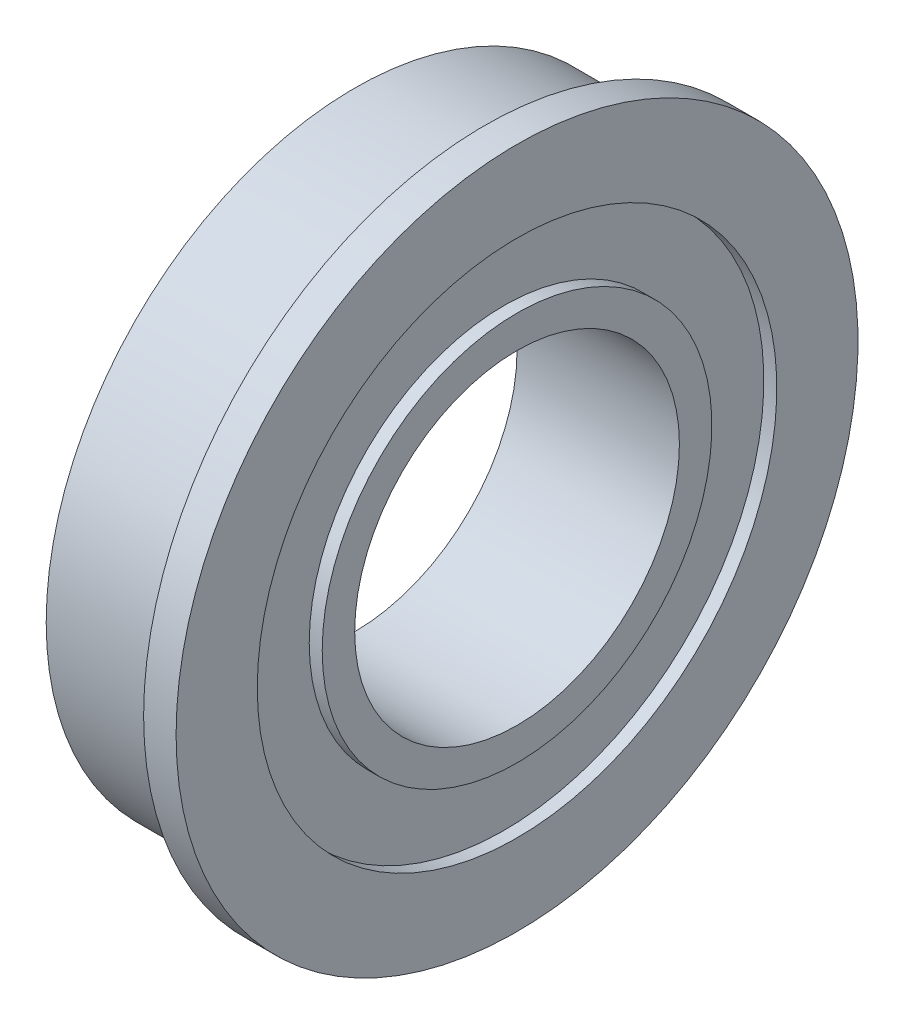
ISO-10303-21;
HEADER;
FILE_DESCRIPTION(('STEP AP214'),'2;1');
FILE_NAME('part.step','',(''),(''),'','','');
FILE_SCHEMA(('AUTOMOTIVE_DESIGN { 1 0 10303 214 1 1 1 1 }'));
ENDSEC;
DATA;
#1=APPLICATION_CONTEXT('core data for automotive mechanical design processes');
#2=APPLICATION_PROTOCOL_DEFINITION('international standard','automotive_design',2000,#1);
#3=PRODUCT_CONTEXT('',#1,'mechanical');
#4=PRODUCT('Part','Part','',(#3));
#5=PRODUCT_RELATED_PRODUCT_CATEGORY('part','',(#4));
#6=PRODUCT_DEFINITION_FORMATION('','',#4);
#7=PRODUCT_DEFINITION_CONTEXT('part definition',#1,'design');
#8=PRODUCT_DEFINITION('design','',#6,#7);
#9=PRODUCT_DEFINITION_SHAPE('','',#8);
#10=(LENGTH_UNIT() NAMED_UNIT(*) SI_UNIT(.MILLI.,.METRE.));
#11=(NAMED_UNIT(*) PLANE_ANGLE_UNIT() SI_UNIT($,.RADIAN.));
#12=(NAMED_UNIT(*) SI_UNIT($,.STERADIAN.) SOLID_ANGLE_UNIT());
#13=UNCERTAINTY_MEASURE_WITH_UNIT(LENGTH_MEASURE(1.E-05),#10,'distance_accuracy_value','');
#14=(GEOMETRIC_REPRESENTATION_CONTEXT(3) GLOBAL_UNCERTAINTY_ASSIGNED_CONTEXT((#13)) GLOBAL_UNIT_ASSIGNED_CONTEXT((#10,
#11,#12)) REPRESENTATION_CONTEXT('',''));
#15=CARTESIAN_POINT('',(0.,0.,0.));
#16=DIRECTION('',(0.,0.,1.));
#17=DIRECTION('',(1.,0.,0.));
#18=AXIS2_PLACEMENT_3D('',#15,#16,#17);
#19=CARTESIAN_POINT('',(4.,9.5,0.));
#20=DIRECTION('',(1.,0.,0.));
#21=DIRECTION('',(0.,0.,-1.));
#22=AXIS2_PLACEMENT_3D('',#19,#20,#21);
#23=PLANE('',#22);
#24=CARTESIAN_POINT('',(4.,0.,0.));
#25=DIRECTION('',(-1.,0.,0.));
#26=DIRECTION('',(0.,0.,1.));
#27=AXIS2_PLACEMENT_3D('',#24,#25,#26);
#28=CIRCLE('',#27,9.5);
#29=CARTESIAN_POINT('',(4.,0.,9.5));
#30=VERTEX_POINT('',#29);
#31=EDGE_CURVE('E10',#30,#30,#28,.T.);
#32=ORIENTED_EDGE('',*,*,#31,.F.);
#33=EDGE_LOOP('',(#32));
#34=FACE_BOUND('',#33,.T.);
#35=CARTESIAN_POINT('',(4.,0.,0.));
#36=DIRECTION('',(-1.,0.,0.));
#37=DIRECTION('',(0.,0.,1.));
#38=AXIS2_PLACEMENT_3D('',#35,#36,#37);
#39=CIRCLE('',#38,10.5);
#40=CARTESIAN_POINT('',(4.,0.,10.5));
#41=VERTEX_POINT('',#40);
#42=EDGE_CURVE('E21',#41,#41,#39,.T.);
#43=ORIENTED_EDGE('',*,*,#42,.T.);
#44=EDGE_LOOP('',(#43));
#45=FACE_BOUND('',#44,.T.);
#46=ADVANCED_FACE('F15',(#34,#45),#23,.F.);
#47=CARTESIAN_POINT('',(0.,0.,0.));
#48=DIRECTION('',(-1.,0.,0.));
#49=DIRECTION('',(0.,0.,1.));
#50=AXIS2_PLACEMENT_3D('',#47,#48,#49);
#51=CYLINDRICAL_SURFACE('',#50,10.5);
#52=ORIENTED_EDGE('',*,*,#42,.F.);
#53=EDGE_LOOP('',(#52));
#54=FACE_BOUND('',#53,.T.);
#55=CARTESIAN_POINT('',(5.,0.,0.));
#56=DIRECTION('',(-1.,0.,0.));
#57=DIRECTION('',(0.,0.,1.));
#58=AXIS2_PLACEMENT_3D('',#55,#56,#57);
#59=CIRCLE('',#58,10.5);
#60=CARTESIAN_POINT('',(5.,0.,10.5));
#61=VERTEX_POINT('',#60);
#62=EDGE_CURVE('E25',#61,#61,#59,.T.);
#63=ORIENTED_EDGE('',*,*,#62,.T.);
#64=EDGE_LOOP('',(#63));
#65=FACE_BOUND('',#64,.T.);
#66=ADVANCED_FACE('F78',(#54,#65),#51,.T.);
#67=CARTESIAN_POINT('',(5.,10.5,0.));
#68=DIRECTION('',(-1.,0.,0.));
#69=DIRECTION('',(0.,0.,1.));
#70=AXIS2_PLACEMENT_3D('',#67,#68,#69);
#71=PLANE('',#70);
#72=ORIENTED_EDGE('',*,*,#62,.F.);
#73=EDGE_LOOP('',(#72));
#74=FACE_BOUND('',#73,.T.);
#75=CARTESIAN_POINT('',(5.,0.,0.));
#76=DIRECTION('',(-1.,0.,0.));
#77=DIRECTION('',(0.,0.,1.));
#78=AXIS2_PLACEMENT_3D('',#75,#76,#77);
#79=CIRCLE('',#78,8.);
#80=CARTESIAN_POINT('',(5.,0.,8.));
#81=VERTEX_POINT('',#80);
#82=EDGE_CURVE('E29',#81,#81,#79,.T.);
#83=ORIENTED_EDGE('',*,*,#82,.T.);
#84=EDGE_LOOP('',(#83));
#85=FACE_BOUND('',#84,.T.);
#86=ADVANCED_FACE('F83',(#74,#85),#71,.F.);
#87=CARTESIAN_POINT('',(0.,0.,0.));
#88=DIRECTION('',(-1.,0.,0.));
#89=DIRECTION('',(0.,0.,1.));
#90=AXIS2_PLACEMENT_3D('',#87,#88,#89);
#91=CYLINDRICAL_SURFACE('',#90,8.);
#92=ORIENTED_EDGE('',*,*,#82,.F.);
#93=EDGE_LOOP('',(#92));
#94=FACE_BOUND('',#93,.T.);
#95=CARTESIAN_POINT('',(4.6,0.,0.));
#96=DIRECTION('',(-1.,0.,0.));
#97=DIRECTION('',(0.,0.,1.));
#98=AXIS2_PLACEMENT_3D('',#95,#96,#97);
#99=CIRCLE('',#98,8.);
#100=CARTESIAN_POINT('',(4.6,0.,8.));
#101=VERTEX_POINT('',#100);
#102=EDGE_CURVE('E34',#101,#101,#99,.T.);
#103=ORIENTED_EDGE('',*,*,#102,.T.);
#104=EDGE_LOOP('',(#103));
#105=FACE_BOUND('',#104,.T.);
#106=ADVANCED_FACE('F88',(#94,#105),#91,.F.);
#107=CARTESIAN_POINT('',(4.6,8.,0.));
#108=DIRECTION('',(-1.,0.,0.));
#109=DIRECTION('',(0.,0.,1.));
#110=AXIS2_PLACEMENT_3D('',#107,#108,#109);
#111=PLANE('',#110);
#112=ORIENTED_EDGE('',*,*,#102,.F.);
#113=EDGE_LOOP('',(#112));
#114=FACE_BOUND('',#113,.T.);
#115=CARTESIAN_POINT('',(4.6,0.,0.));
#116=DIRECTION('',(-1.,0.,0.));
#117=DIRECTION('',(0.,0.,1.));
#118=AXIS2_PLACEMENT_3D('',#115,#116,#117);
#119=CIRCLE('',#118,6.);
#120=CARTESIAN_POINT('',(4.6,0.,6.));
#121=VERTEX_POINT('',#120);
#122=EDGE_CURVE('E37',#121,#121,#119,.T.);
#123=ORIENTED_EDGE('',*,*,#122,.T.);
#124=EDGE_LOOP('',(#123));
#125=FACE_BOUND('',#124,.T.);
#126=ADVANCED_FACE('F95',(#114,#125),#111,.F.);
#127=CARTESIAN_POINT('',(0.,0.,0.));
#128=DIRECTION('',(-1.,0.,0.));
#129=DIRECTION('',(0.,0.,1.));
#130=AXIS2_PLACEMENT_3D('',#127,#128,#129);
#131=CYLINDRICAL_SURFACE('',#130,6.);
#132=ORIENTED_EDGE('',*,*,#122,.F.);
#133=EDGE_LOOP('',(#132));
#134=FACE_BOUND('',#133,.T.);
#135=CARTESIAN_POINT('',(5.,0.,0.));
#136=DIRECTION('',(-1.,0.,0.));
#137=DIRECTION('',(0.,0.,1.));
#138=AXIS2_PLACEMENT_3D('',#135,#136,#137);
#139=CIRCLE('',#138,6.);
#140=CARTESIAN_POINT('',(5.,0.,6.));
#141=VERTEX_POINT('',#140);
#142=EDGE_CURVE('E40',#141,#141,#139,.T.);
#143=ORIENTED_EDGE('',*,*,#142,.T.);
#144=EDGE_LOOP('',(#143));
#145=FACE_BOUND('',#144,.T.);
#146=ADVANCED_FACE('F99',(#134,#145),#131,.T.);
#147=CARTESIAN_POINT('',(5.,6.,0.));
#148=DIRECTION('',(-1.,0.,0.));
#149=DIRECTION('',(0.,0.,1.));
#150=AXIS2_PLACEMENT_3D('',#147,#148,#149);
#151=PLANE('',#150);
#152=ORIENTED_EDGE('',*,*,#142,.F.);
#153=EDGE_LOOP('',(#152));
#154=FACE_BOUND('',#153,.T.);
#155=CARTESIAN_POINT('',(5.,0.,0.));
#156=DIRECTION('',(-1.,0.,0.));
#157=DIRECTION('',(0.,0.,1.));
#158=AXIS2_PLACEMENT_3D('',#155,#156,#157);
#159=CIRCLE('',#158,5.);
#160=CARTESIAN_POINT('',(5.,0.,5.));
#161=VERTEX_POINT('',#160);
#162=EDGE_CURVE('E43',#161,#161,#159,.T.);
#163=ORIENTED_EDGE('',*,*,#162,.T.);
#164=EDGE_LOOP('',(#163));
#165=FACE_BOUND('',#164,.T.);
#166=ADVANCED_FACE('F103',(#154,#165),#151,.F.);
#167=CARTESIAN_POINT('',(0.,0.,0.));
#168=DIRECTION('',(-1.,0.,0.));
#169=DIRECTION('',(0.,0.,1.));
#170=AXIS2_PLACEMENT_3D('',#167,#168,#169);
#171=CYLINDRICAL_SURFACE('',#170,5.);
#172=ORIENTED_EDGE('',*,*,#162,.F.);
#173=EDGE_LOOP('',(#172));
#174=FACE_BOUND('',#173,.T.);
#175=CARTESIAN_POINT('',(0.,0.,0.));
#176=DIRECTION('',(-1.,0.,0.));
#177=DIRECTION('',(0.,0.,1.));
#178=AXIS2_PLACEMENT_3D('',#175,#176,#177);
#179=CIRCLE('',#178,5.);
#180=CARTESIAN_POINT('',(0.,0.,5.));
#181=VERTEX_POINT('',#180);
#182=EDGE_CURVE('E46',#181,#181,#179,.T.);
#183=ORIENTED_EDGE('',*,*,#182,.T.);
#184=EDGE_LOOP('',(#183));
#185=FACE_BOUND('',#184,.T.);
#186=ADVANCED_FACE('F107',(#174,#185),#171,.F.);
#187=CARTESIAN_POINT('',(0.,5.,0.));
#188=DIRECTION('',(1.,0.,0.));
#189=DIRECTION('',(0.,0.,-1.));
#190=AXIS2_PLACEMENT_3D('',#187,#188,#189);
#191=PLANE('',#190);
#192=ORIENTED_EDGE('',*,*,#182,.F.);
#193=EDGE_LOOP('',(#192));
#194=FACE_BOUND('',#193,.T.);
#195=CARTESIAN_POINT('',(0.,0.,0.));
#196=DIRECTION('',(-1.,0.,0.));
#197=DIRECTION('',(0.,0.,1.));
#198=AXIS2_PLACEMENT_3D('',#195,#196,#197);
#199=CIRCLE('',#198,6.);
#200=CARTESIAN_POINT('',(0.,0.,6.));
#201=VERTEX_POINT('',#200);
#202=EDGE_CURVE('E49',#201,#201,#199,.T.);
#203=ORIENTED_EDGE('',*,*,#202,.T.);
#204=EDGE_LOOP('',(#203));
#205=FACE_BOUND('',#204,.T.);
#206=ADVANCED_FACE('F111',(#194,#205),#191,.F.);
#207=CARTESIAN_POINT('',(0.,0.,0.));
#208=DIRECTION('',(-1.,0.,0.));
#209=DIRECTION('',(0.,0.,1.));
#210=AXIS2_PLACEMENT_3D('',#207,#208,#209);
#211=CYLINDRICAL_SURFACE('',#210,6.);
#212=ORIENTED_EDGE('',*,*,#202,.F.);
#213=EDGE_LOOP('',(#212));
#214=FACE_BOUND('',#213,.T.);
#215=CARTESIAN_POINT('',(0.4,0.,0.));
#216=DIRECTION('',(-1.,0.,0.));
#217=DIRECTION('',(0.,0.,1.));
#218=AXIS2_PLACEMENT_3D('',#215,#216,#217);
#219=CIRCLE('',#218,6.);
#220=CARTESIAN_POINT('',(0.4,0.,6.));
#221=VERTEX_POINT('',#220);
#222=EDGE_CURVE('E52',#221,#221,#219,.T.);
#223=ORIENTED_EDGE('',*,*,#222,.T.);
#224=EDGE_LOOP('',(#223));
#225=FACE_BOUND('',#224,.T.);
#226=ADVANCED_FACE('F115',(#214,#225),#211,.T.);
#227=CARTESIAN_POINT('',(0.4,6.,0.));
#228=DIRECTION('',(1.,0.,0.));
#229=DIRECTION('',(0.,0.,-1.));
#230=AXIS2_PLACEMENT_3D('',#227,#228,#229);
#231=PLANE('',#230);
#232=ORIENTED_EDGE('',*,*,#222,.F.);
#233=EDGE_LOOP('',(#232));
#234=FACE_BOUND('',#233,.T.);
#235=CARTESIAN_POINT('',(0.4,0.,0.));
#236=DIRECTION('',(-1.,0.,0.));
#237=DIRECTION('',(0.,0.,1.));
#238=AXIS2_PLACEMENT_3D('',#235,#236,#237);
#239=CIRCLE('',#238,8.);
#240=CARTESIAN_POINT('',(0.4,0.,8.));
#241=VERTEX_POINT('',#240);
#242=EDGE_CURVE('E55',#241,#241,#239,.T.);
#243=ORIENTED_EDGE('',*,*,#242,.T.);
#244=EDGE_LOOP('',(#243));
#245=FACE_BOUND('',#244,.T.);
#246=ADVANCED_FACE('F119',(#234,#245),#231,.F.);
#247=CARTESIAN_POINT('',(0.,0.,0.));
#248=DIRECTION('',(-1.,0.,0.));
#249=DIRECTION('',(0.,0.,1.));
#250=AXIS2_PLACEMENT_3D('',#247,#248,#249);
#251=CYLINDRICAL_SURFACE('',#250,8.);
#252=ORIENTED_EDGE('',*,*,#242,.F.);
#253=EDGE_LOOP('',(#252));
#254=FACE_BOUND('',#253,.T.);
#255=CARTESIAN_POINT('',(0.,0.,0.));
#256=DIRECTION('',(-1.,0.,0.));
#257=DIRECTION('',(0.,0.,1.));
#258=AXIS2_PLACEMENT_3D('',#255,#256,#257);
#259=CIRCLE('',#258,8.);
#260=CARTESIAN_POINT('',(0.,0.,8.));
#261=VERTEX_POINT('',#260);
#262=EDGE_CURVE('E58',#261,#261,#259,.T.);
#263=ORIENTED_EDGE('',*,*,#262,.T.);
#264=EDGE_LOOP('',(#263));
#265=FACE_BOUND('',#264,.T.);
#266=ADVANCED_FACE('F74',(#254,#265),#251,.F.);
#267=CARTESIAN_POINT('',(0.,8.,0.));
#268=DIRECTION('',(1.,0.,0.));
#269=DIRECTION('',(0.,0.,-1.));
#270=AXIS2_PLACEMENT_3D('',#267,#268,#269);
#271=PLANE('',#270);
#272=ORIENTED_EDGE('',*,*,#262,.F.);
#273=EDGE_LOOP('',(#272));
#274=FACE_BOUND('',#273,.T.);
#275=CARTESIAN_POINT('',(0.,0.,0.));
#276=DIRECTION('',(-1.,0.,0.));
#277=DIRECTION('',(0.,0.,1.));
#278=AXIS2_PLACEMENT_3D('',#275,#276,#277);
#279=CIRCLE('',#278,9.5);
#280=CARTESIAN_POINT('',(0.,0.,9.5));
#281=VERTEX_POINT('',#280);
#282=EDGE_CURVE('E61',#281,#281,#279,.T.);
#283=ORIENTED_EDGE('',*,*,#282,.T.);
#284=EDGE_LOOP('',(#283));
#285=FACE_BOUND('',#284,.T.);
#286=ADVANCED_FACE('F65',(#274,#285),#271,.F.);
#287=CARTESIAN_POINT('',(0.,0.,0.));
#288=DIRECTION('',(-1.,0.,0.));
#289=DIRECTION('',(0.,0.,1.));
#290=AXIS2_PLACEMENT_3D('',#287,#288,#289);
#291=CYLINDRICAL_SURFACE('',#290,9.5);
#292=ORIENTED_EDGE('',*,*,#282,.F.);
#293=EDGE_LOOP('',(#292));
#294=FACE_BOUND('',#293,.T.);
#295=ORIENTED_EDGE('',*,*,#31,.T.);
#296=EDGE_LOOP('',(#295));
#297=FACE_BOUND('',#296,.T.);
#298=ADVANCED_FACE('F67',(#294,#297),#291,.T.);
#299=CLOSED_SHELL('',(#46,#66,#86,#106,#126,#146,#166,#186,#206,#226,#246,#266,#286,#298));
#300=MANIFOLD_SOLID_BREP('B1',#299);
#301=ADVANCED_BREP_SHAPE_REPRESENTATION('',(#18,#300),#14);
#302=SHAPE_DEFINITION_REPRESENTATION(#9,#301);
ENDSEC;
END-ISO-10303-21;
